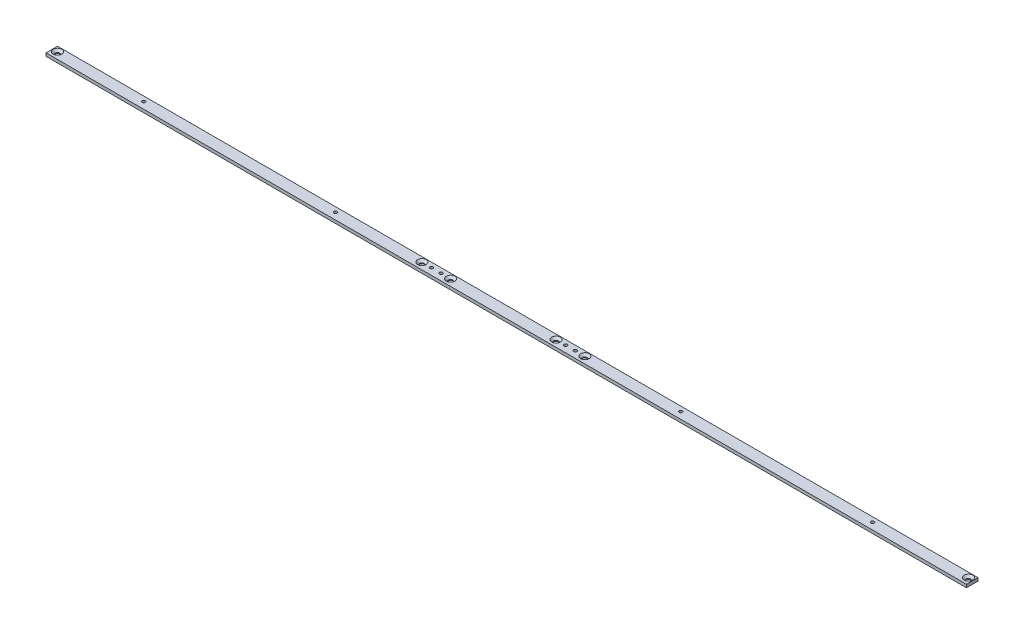
ISO-10303-21;
HEADER;
FILE_DESCRIPTION(('STEP AP214'),'2;1');
FILE_NAME('part.step','',(''),(''),'','','');
FILE_SCHEMA(('AUTOMOTIVE_DESIGN { 1 0 10303 214 1 1 1 1 }'));
ENDSEC;
DATA;
#1=APPLICATION_CONTEXT('core data for automotive mechanical design processes');
#2=APPLICATION_PROTOCOL_DEFINITION('international standard','automotive_design',2000,#1);
#3=PRODUCT_CONTEXT('',#1,'mechanical');
#4=PRODUCT('Part','Part','',(#3));
#5=PRODUCT_RELATED_PRODUCT_CATEGORY('part','',(#4));
#6=PRODUCT_DEFINITION_FORMATION('','',#4);
#7=PRODUCT_DEFINITION_CONTEXT('part definition',#1,'design');
#8=PRODUCT_DEFINITION('design','',#6,#7);
#9=PRODUCT_DEFINITION_SHAPE('','',#8);
#10=(LENGTH_UNIT() NAMED_UNIT(*) SI_UNIT(.MILLI.,.METRE.));
#11=(NAMED_UNIT(*) PLANE_ANGLE_UNIT() SI_UNIT($,.RADIAN.));
#12=(NAMED_UNIT(*) SI_UNIT($,.STERADIAN.) SOLID_ANGLE_UNIT());
#13=UNCERTAINTY_MEASURE_WITH_UNIT(LENGTH_MEASURE(1.E-05),#10,'distance_accuracy_value','');
#14=(GEOMETRIC_REPRESENTATION_CONTEXT(3) GLOBAL_UNCERTAINTY_ASSIGNED_CONTEXT((#13)) GLOBAL_UNIT_ASSIGNED_CONTEXT((#10,
#11,#12)) REPRESENTATION_CONTEXT('',''));
#15=CARTESIAN_POINT('',(0.,0.,0.));
#16=DIRECTION('',(0.,0.,1.));
#17=DIRECTION('',(1.,0.,0.));
#18=AXIS2_PLACEMENT_3D('',#15,#16,#17);
#19=CARTESIAN_POINT('',(0.,0.,0.));
#20=DIRECTION('',(0.,-1.,0.));
#21=DIRECTION('',(0.,0.,-1.));
#22=AXIS2_PLACEMENT_3D('',#19,#20,#21);
#23=PLANE('',#22);
#24=CARTESIAN_POINT('',(-85.0000000000001,0.,-1.));
#25=DIRECTION('',(0.,1.,0.));
#26=DIRECTION('',(0.,0.,1.));
#27=AXIS2_PLACEMENT_3D('',#24,#25,#26);
#28=CIRCLE('',#27,1.65);
#29=CARTESIAN_POINT('',(-85.0000000000001,0.,0.649999999999999));
#30=VERTEX_POINT('',#29);
#31=EDGE_CURVE('E261',#30,#30,#28,.T.);
#32=ORIENTED_EDGE('',*,*,#31,.T.);
#33=EDGE_LOOP('',(#32));
#34=FACE_BOUND('',#33,.T.);
#35=CARTESIAN_POINT('',(-185.,0.,-1.00000000000004));
#36=DIRECTION('',(0.,1.,0.));
#37=DIRECTION('',(0.,0.,1.));
#38=AXIS2_PLACEMENT_3D('',#35,#36,#37);
#39=CIRCLE('',#38,1.65000000000001);
#40=CARTESIAN_POINT('',(-185.,0.,0.649999999999973));
#41=VERTEX_POINT('',#40);
#42=EDGE_CURVE('E205',#41,#41,#39,.T.);
#43=ORIENTED_EDGE('',*,*,#42,.T.);
#44=EDGE_LOOP('',(#43));
#45=FACE_BOUND('',#44,.T.);
#46=CARTESIAN_POINT('',(475.,0.,-0.999999999999995));
#47=DIRECTION('',(0.,1.,0.));
#48=DIRECTION('',(0.,0.,1.));
#49=AXIS2_PLACEMENT_3D('',#46,#47,#48);
#50=CIRCLE('',#49,2.24999999999997);
#51=CARTESIAN_POINT('',(475.,0.,1.24999999999998));
#52=VERTEX_POINT('',#51);
#53=EDGE_CURVE('E193',#52,#52,#50,.T.);
#54=ORIENTED_EDGE('',*,*,#53,.T.);
#55=EDGE_LOOP('',(#54));
#56=FACE_BOUND('',#55,.T.);
#57=CARTESIAN_POINT('',(-95.0000000000001,0.,-0.999999999999995));
#58=DIRECTION('',(0.,1.,0.));
#59=DIRECTION('',(0.,0.,1.));
#60=AXIS2_PLACEMENT_3D('',#57,#58,#59);
#61=CIRCLE('',#60,2.25);
#62=CARTESIAN_POINT('',(-95.0000000000001,0.,1.25000000000001));
#63=VERTEX_POINT('',#62);
#64=EDGE_CURVE('E181',#63,#63,#61,.T.);
#65=ORIENTED_EDGE('',*,*,#64,.T.);
#66=EDGE_LOOP('',(#65));
#67=FACE_BOUND('',#66,.T.);
#68=CARTESIAN_POINT('',(-65.0000000000001,0.,-1.));
#69=DIRECTION('',(0.,1.,0.));
#70=DIRECTION('',(0.,0.,1.));
#71=AXIS2_PLACEMENT_3D('',#68,#69,#70);
#72=CIRCLE('',#71,2.25);
#73=CARTESIAN_POINT('',(-65.0000000000001,0.,1.25));
#74=VERTEX_POINT('',#73);
#75=EDGE_CURVE('E169',#74,#74,#72,.T.);
#76=ORIENTED_EDGE('',*,*,#75,.T.);
#77=EDGE_LOOP('',(#76));
#78=FACE_BOUND('',#77,.T.);
#79=CARTESIAN_POINT('',(44.9999999999999,0.,-1.));
#80=DIRECTION('',(0.,1.,0.));
#81=DIRECTION('',(0.,0.,1.));
#82=AXIS2_PLACEMENT_3D('',#79,#80,#81);
#83=CIRCLE('',#82,2.25);
#84=CARTESIAN_POINT('',(44.9999999999999,0.,1.25));
#85=VERTEX_POINT('',#84);
#86=EDGE_CURVE('E157',#85,#85,#83,.T.);
#87=ORIENTED_EDGE('',*,*,#86,.T.);
#88=EDGE_LOOP('',(#87));
#89=FACE_BOUND('',#88,.T.);
#90=CARTESIAN_POINT('',(74.9999999999999,0.,-1.00000000000001));
#91=DIRECTION('',(0.,1.,0.));
#92=DIRECTION('',(0.,0.,1.));
#93=AXIS2_PLACEMENT_3D('',#90,#91,#92);
#94=CIRCLE('',#93,2.25);
#95=CARTESIAN_POINT('',(74.9999999999999,0.,1.25));
#96=VERTEX_POINT('',#95);
#97=EDGE_CURVE('E145',#96,#96,#94,.T.);
#98=ORIENTED_EDGE('',*,*,#97,.T.);
#99=EDGE_LOOP('',(#98));
#100=FACE_BOUND('',#99,.T.);
#101=CARTESIAN_POINT('',(-475.,0.,-1.));
#102=DIRECTION('',(0.,1.,0.));
#103=DIRECTION('',(0.,0.,1.));
#104=AXIS2_PLACEMENT_3D('',#101,#102,#103);
#105=CIRCLE('',#104,2.24999999999997);
#106=CARTESIAN_POINT('',(-475.,0.,1.24999999999997));
#107=VERTEX_POINT('',#106);
#108=EDGE_CURVE('E117',#107,#107,#105,.T.);
#109=ORIENTED_EDGE('',*,*,#108,.T.);
#110=EDGE_LOOP('',(#109));
#111=FACE_BOUND('',#110,.T.);
#112=DIRECTION('',(0.,0.,-1.));
#113=VECTOR('',#112,1.);
#114=CARTESIAN_POINT('',(480.,0.,6.));
#115=LINE('',#114,#113);
#116=CARTESIAN_POINT('',(480.,0.,6.));
#117=VERTEX_POINT('',#116);
#118=CARTESIAN_POINT('',(480.,0.,-6.));
#119=VERTEX_POINT('',#118);
#120=EDGE_CURVE('E113',#117,#119,#115,.T.);
#121=ORIENTED_EDGE('',*,*,#120,.F.);
#122=DIRECTION('',(1.,0.,0.));
#123=VECTOR('',#122,1.);
#124=CARTESIAN_POINT('',(-480.,0.,6.));
#125=LINE('',#124,#123);
#126=CARTESIAN_POINT('',(-480.,0.,6.));
#127=VERTEX_POINT('',#126);
#128=EDGE_CURVE('E84',#127,#117,#125,.T.);
#129=ORIENTED_EDGE('',*,*,#128,.F.);
#130=DIRECTION('',(0.,0.,1.));
#131=VECTOR('',#130,1.);
#132=CARTESIAN_POINT('',(-480.,0.,6.));
#133=LINE('',#132,#131);
#134=CARTESIAN_POINT('',(-480.,0.,-6.));
#135=VERTEX_POINT('',#134);
#136=EDGE_CURVE('E78',#135,#127,#133,.T.);
#137=ORIENTED_EDGE('',*,*,#136,.F.);
#138=DIRECTION('',(-1.,0.,0.));
#139=VECTOR('',#138,1.);
#140=CARTESIAN_POINT('',(-480.,0.,-6.));
#141=LINE('',#140,#139);
#142=EDGE_CURVE('E102',#119,#135,#141,.T.);
#143=ORIENTED_EDGE('',*,*,#142,.F.);
#144=EDGE_LOOP('',(#121,#129,#137,#143));
#145=FACE_BOUND('',#144,.T.);
#146=CARTESIAN_POINT('',(-385.,0.,-1.));
#147=DIRECTION('',(0.,1.,0.));
#148=DIRECTION('',(0.,0.,1.));
#149=AXIS2_PLACEMENT_3D('',#146,#147,#148);
#150=CIRCLE('',#149,1.64999999999998);
#151=CARTESIAN_POINT('',(-385.,0.,0.649999999999984));
#152=VERTEX_POINT('',#151);
#153=EDGE_CURVE('E213',#152,#152,#150,.T.);
#154=ORIENTED_EDGE('',*,*,#153,.T.);
#155=EDGE_LOOP('',(#154));
#156=FACE_BOUND('',#155,.T.);
#157=CARTESIAN_POINT('',(375.,0.,-1.00000000000006));
#158=DIRECTION('',(0.,1.,0.));
#159=DIRECTION('',(0.,0.,1.));
#160=AXIS2_PLACEMENT_3D('',#157,#158,#159);
#161=CIRCLE('',#160,1.64999999999998);
#162=CARTESIAN_POINT('',(375.,0.,0.649999999999928));
#163=VERTEX_POINT('',#162);
#164=EDGE_CURVE('E221',#163,#163,#161,.T.);
#165=ORIENTED_EDGE('',*,*,#164,.T.);
#166=EDGE_LOOP('',(#165));
#167=FACE_BOUND('',#166,.T.);
#168=CARTESIAN_POINT('',(175.,0.,-1.00000000000002));
#169=DIRECTION('',(0.,1.,0.));
#170=DIRECTION('',(0.,0.,1.));
#171=AXIS2_PLACEMENT_3D('',#168,#169,#170);
#172=CIRCLE('',#171,1.65000000000001);
#173=CARTESIAN_POINT('',(175.,0.,0.649999999999994));
#174=VERTEX_POINT('',#173);
#175=EDGE_CURVE('E229',#174,#174,#172,.T.);
#176=ORIENTED_EDGE('',*,*,#175,.T.);
#177=EDGE_LOOP('',(#176));
#178=FACE_BOUND('',#177,.T.);
#179=CARTESIAN_POINT('',(64.9999999999999,0.,-1.));
#180=DIRECTION('',(0.,1.,0.));
#181=DIRECTION('',(0.,0.,1.));
#182=AXIS2_PLACEMENT_3D('',#179,#180,#181);
#183=CIRCLE('',#182,1.65);
#184=CARTESIAN_POINT('',(64.9999999999999,0.,0.649999999999999));
#185=VERTEX_POINT('',#184);
#186=EDGE_CURVE('E237',#185,#185,#183,.T.);
#187=ORIENTED_EDGE('',*,*,#186,.T.);
#188=EDGE_LOOP('',(#187));
#189=FACE_BOUND('',#188,.T.);
#190=CARTESIAN_POINT('',(54.9999999999999,0.,-1.));
#191=DIRECTION('',(0.,1.,0.));
#192=DIRECTION('',(0.,0.,1.));
#193=AXIS2_PLACEMENT_3D('',#190,#191,#192);
#194=CIRCLE('',#193,1.65);
#195=CARTESIAN_POINT('',(54.9999999999999,0.,0.649999999999999));
#196=VERTEX_POINT('',#195);
#197=EDGE_CURVE('E245',#196,#196,#194,.T.);
#198=ORIENTED_EDGE('',*,*,#197,.T.);
#199=EDGE_LOOP('',(#198));
#200=FACE_BOUND('',#199,.T.);
#201=CARTESIAN_POINT('',(-75.0000000000001,0.,-1.));
#202=DIRECTION('',(0.,1.,0.));
#203=DIRECTION('',(0.,0.,1.));
#204=AXIS2_PLACEMENT_3D('',#201,#202,#203);
#205=CIRCLE('',#204,1.65);
#206=CARTESIAN_POINT('',(-75.0000000000001,0.,0.649999999999999));
#207=VERTEX_POINT('',#206);
#208=EDGE_CURVE('E253',#207,#207,#205,.T.);
#209=ORIENTED_EDGE('',*,*,#208,.T.);
#210=EDGE_LOOP('',(#209));
#211=FACE_BOUND('',#210,.T.);
#212=ADVANCED_FACE('F43',(#34,#45,#56,#67,#78,#89,#100,#111,#145,#156,#167,#178,#189,#200,#211),
#23,.T.);
#213=CARTESIAN_POINT('',(0.,3.175,0.));
#214=DIRECTION('',(0.,-1.,0.));
#215=DIRECTION('',(0.,0.,-1.));
#216=AXIS2_PLACEMENT_3D('',#213,#214,#215);
#217=PLANE('',#216);
#218=CARTESIAN_POINT('',(-85.0000000000001,3.175,-1.));
#219=DIRECTION('',(0.,1.,0.));
#220=DIRECTION('',(0.,0.,1.));
#221=AXIS2_PLACEMENT_3D('',#218,#219,#220);
#222=CIRCLE('',#221,1.65);
#223=CARTESIAN_POINT('',(-85.0000000000001,3.175,0.649999999999999));
#224=VERTEX_POINT('',#223);
#225=EDGE_CURVE('E265',#224,#224,#222,.T.);
#226=ORIENTED_EDGE('',*,*,#225,.F.);
#227=EDGE_LOOP('',(#226));
#228=FACE_BOUND('',#227,.T.);
#229=CARTESIAN_POINT('',(-75.0000000000001,3.175,-1.));
#230=DIRECTION('',(0.,1.,0.));
#231=DIRECTION('',(0.,0.,1.));
#232=AXIS2_PLACEMENT_3D('',#229,#230,#231);
#233=CIRCLE('',#232,1.65);
#234=CARTESIAN_POINT('',(-75.0000000000001,3.175,0.649999999999999));
#235=VERTEX_POINT('',#234);
#236=EDGE_CURVE('E257',#235,#235,#233,.T.);
#237=ORIENTED_EDGE('',*,*,#236,.F.);
#238=EDGE_LOOP('',(#237));
#239=FACE_BOUND('',#238,.T.);
#240=CARTESIAN_POINT('',(175.,3.175,-1.00000000000002));
#241=DIRECTION('',(0.,1.,0.));
#242=DIRECTION('',(0.,0.,1.));
#243=AXIS2_PLACEMENT_3D('',#240,#241,#242);
#244=CIRCLE('',#243,1.65000000000001);
#245=CARTESIAN_POINT('',(175.,3.175,0.649999999999994));
#246=VERTEX_POINT('',#245);
#247=EDGE_CURVE('E233',#246,#246,#244,.T.);
#248=ORIENTED_EDGE('',*,*,#247,.F.);
#249=EDGE_LOOP('',(#248));
#250=FACE_BOUND('',#249,.T.);
#251=CARTESIAN_POINT('',(375.,3.175,-1.00000000000006));
#252=DIRECTION('',(0.,1.,0.));
#253=DIRECTION('',(0.,0.,1.));
#254=AXIS2_PLACEMENT_3D('',#251,#252,#253);
#255=CIRCLE('',#254,1.64999999999998);
#256=CARTESIAN_POINT('',(375.,3.175,0.649999999999928));
#257=VERTEX_POINT('',#256);
#258=EDGE_CURVE('E225',#257,#257,#255,.T.);
#259=ORIENTED_EDGE('',*,*,#258,.F.);
#260=EDGE_LOOP('',(#259));
#261=FACE_BOUND('',#260,.T.);
#262=CARTESIAN_POINT('',(475.,3.175,-0.999999999999995));
#263=DIRECTION('',(0.,1.,0.));
#264=DIRECTION('',(0.,0.,1.));
#265=AXIS2_PLACEMENT_3D('',#262,#263,#264);
#266=CIRCLE('',#265,4.47999999999998);
#267=CARTESIAN_POINT('',(475.,3.175,3.47999999999999));
#268=VERTEX_POINT('',#267);
#269=EDGE_CURVE('E201',#268,#268,#266,.T.);
#270=ORIENTED_EDGE('',*,*,#269,.F.);
#271=EDGE_LOOP('',(#270));
#272=FACE_BOUND('',#271,.T.);
#273=CARTESIAN_POINT('',(-95.0000000000001,3.175,-0.999999999999995));
#274=DIRECTION('',(0.,1.,0.));
#275=DIRECTION('',(0.,0.,1.));
#276=AXIS2_PLACEMENT_3D('',#273,#274,#275);
#277=CIRCLE('',#276,4.48);
#278=CARTESIAN_POINT('',(-95.0000000000001,3.175,3.48));
#279=VERTEX_POINT('',#278);
#280=EDGE_CURVE('E189',#279,#279,#277,.T.);
#281=ORIENTED_EDGE('',*,*,#280,.F.);
#282=EDGE_LOOP('',(#281));
#283=FACE_BOUND('',#282,.T.);
#284=CARTESIAN_POINT('',(-65.0000000000001,3.175,-1.));
#285=DIRECTION('',(0.,1.,0.));
#286=DIRECTION('',(0.,0.,1.));
#287=AXIS2_PLACEMENT_3D('',#284,#285,#286);
#288=CIRCLE('',#287,4.48);
#289=CARTESIAN_POINT('',(-65.0000000000001,3.175,3.48));
#290=VERTEX_POINT('',#289);
#291=EDGE_CURVE('E177',#290,#290,#288,.T.);
#292=ORIENTED_EDGE('',*,*,#291,.F.);
#293=EDGE_LOOP('',(#292));
#294=FACE_BOUND('',#293,.T.);
#295=CARTESIAN_POINT('',(44.9999999999999,3.175,-1.));
#296=DIRECTION('',(0.,1.,0.));
#297=DIRECTION('',(0.,0.,1.));
#298=AXIS2_PLACEMENT_3D('',#295,#296,#297);
#299=CIRCLE('',#298,4.48);
#300=CARTESIAN_POINT('',(44.9999999999999,3.175,3.48));
#301=VERTEX_POINT('',#300);
#302=EDGE_CURVE('E165',#301,#301,#299,.T.);
#303=ORIENTED_EDGE('',*,*,#302,.F.);
#304=EDGE_LOOP('',(#303));
#305=FACE_BOUND('',#304,.T.);
#306=CARTESIAN_POINT('',(74.9999999999999,3.175,-1.00000000000001));
#307=DIRECTION('',(0.,1.,0.));
#308=DIRECTION('',(0.,0.,1.));
#309=AXIS2_PLACEMENT_3D('',#306,#307,#308);
#310=CIRCLE('',#309,4.48);
#311=CARTESIAN_POINT('',(74.9999999999999,3.175,3.47999999999999));
#312=VERTEX_POINT('',#311);
#313=EDGE_CURVE('E153',#312,#312,#310,.T.);
#314=ORIENTED_EDGE('',*,*,#313,.F.);
#315=EDGE_LOOP('',(#314));
#316=FACE_BOUND('',#315,.T.);
#317=CARTESIAN_POINT('',(-475.,3.175,-1.));
#318=DIRECTION('',(0.,1.,0.));
#319=DIRECTION('',(0.,0.,1.));
#320=AXIS2_PLACEMENT_3D('',#317,#318,#319);
#321=CIRCLE('',#320,4.47999999999998);
#322=CARTESIAN_POINT('',(-475.,3.175,3.47999999999998));
#323=VERTEX_POINT('',#322);
#324=EDGE_CURVE('E141',#323,#323,#321,.T.);
#325=ORIENTED_EDGE('',*,*,#324,.F.);
#326=EDGE_LOOP('',(#325));
#327=FACE_BOUND('',#326,.T.);
#328=DIRECTION('',(0.,0.,-1.));
#329=VECTOR('',#328,1.);
#330=CARTESIAN_POINT('',(480.,3.175,6.));
#331=LINE('',#330,#329);
#332=CARTESIAN_POINT('',(480.,3.175,6.));
#333=VERTEX_POINT('',#332);
#334=CARTESIAN_POINT('',(480.,3.175,-6.));
#335=VERTEX_POINT('',#334);
#336=EDGE_CURVE('E97',#333,#335,#331,.T.);
#337=ORIENTED_EDGE('',*,*,#336,.T.);
#338=DIRECTION('',(-1.,0.,0.));
#339=VECTOR('',#338,1.);
#340=CARTESIAN_POINT('',(-480.,3.175,-6.));
#341=LINE('',#340,#339);
#342=CARTESIAN_POINT('',(-480.,3.175,-6.));
#343=VERTEX_POINT('',#342);
#344=EDGE_CURVE('E91',#335,#343,#341,.T.);
#345=ORIENTED_EDGE('',*,*,#344,.T.);
#346=DIRECTION('',(0.,0.,1.));
#347=VECTOR('',#346,1.);
#348=CARTESIAN_POINT('',(-480.,3.175,6.));
#349=LINE('',#348,#347);
#350=CARTESIAN_POINT('',(-480.,3.175,6.));
#351=VERTEX_POINT('',#350);
#352=EDGE_CURVE('E95',#343,#351,#349,.T.);
#353=ORIENTED_EDGE('',*,*,#352,.T.);
#354=DIRECTION('',(1.,0.,0.));
#355=VECTOR('',#354,1.);
#356=CARTESIAN_POINT('',(-480.,3.175,6.));
#357=LINE('',#356,#355);
#358=EDGE_CURVE('E61',#351,#333,#357,.T.);
#359=ORIENTED_EDGE('',*,*,#358,.T.);
#360=EDGE_LOOP('',(#337,#345,#353,#359));
#361=FACE_BOUND('',#360,.T.);
#362=CARTESIAN_POINT('',(-185.,3.175,-1.00000000000004));
#363=DIRECTION('',(0.,1.,0.));
#364=DIRECTION('',(0.,0.,1.));
#365=AXIS2_PLACEMENT_3D('',#362,#363,#364);
#366=CIRCLE('',#365,1.65000000000001);
#367=CARTESIAN_POINT('',(-185.,3.175,0.649999999999973));
#368=VERTEX_POINT('',#367);
#369=EDGE_CURVE('E209',#368,#368,#366,.T.);
#370=ORIENTED_EDGE('',*,*,#369,.F.);
#371=EDGE_LOOP('',(#370));
#372=FACE_BOUND('',#371,.T.);
#373=CARTESIAN_POINT('',(-385.,3.175,-1.));
#374=DIRECTION('',(0.,1.,0.));
#375=DIRECTION('',(0.,0.,1.));
#376=AXIS2_PLACEMENT_3D('',#373,#374,#375);
#377=CIRCLE('',#376,1.64999999999998);
#378=CARTESIAN_POINT('',(-385.,3.175,0.649999999999984));
#379=VERTEX_POINT('',#378);
#380=EDGE_CURVE('E217',#379,#379,#377,.T.);
#381=ORIENTED_EDGE('',*,*,#380,.F.);
#382=EDGE_LOOP('',(#381));
#383=FACE_BOUND('',#382,.T.);
#384=CARTESIAN_POINT('',(64.9999999999999,3.175,-1.));
#385=DIRECTION('',(0.,1.,0.));
#386=DIRECTION('',(0.,0.,1.));
#387=AXIS2_PLACEMENT_3D('',#384,#385,#386);
#388=CIRCLE('',#387,1.65);
#389=CARTESIAN_POINT('',(64.9999999999999,3.175,0.649999999999999));
#390=VERTEX_POINT('',#389);
#391=EDGE_CURVE('E241',#390,#390,#388,.T.);
#392=ORIENTED_EDGE('',*,*,#391,.F.);
#393=EDGE_LOOP('',(#392));
#394=FACE_BOUND('',#393,.T.);
#395=CARTESIAN_POINT('',(54.9999999999999,3.175,-1.));
#396=DIRECTION('',(0.,1.,0.));
#397=DIRECTION('',(0.,0.,1.));
#398=AXIS2_PLACEMENT_3D('',#395,#396,#397);
#399=CIRCLE('',#398,1.65);
#400=CARTESIAN_POINT('',(54.9999999999999,3.175,0.649999999999999));
#401=VERTEX_POINT('',#400);
#402=EDGE_CURVE('E249',#401,#401,#399,.T.);
#403=ORIENTED_EDGE('',*,*,#402,.F.);
#404=EDGE_LOOP('',(#403));
#405=FACE_BOUND('',#404,.T.);
#406=ADVANCED_FACE('F92',(#228,#239,#250,#261,#272,#283,#294,#305,#316,#327,#361,#372,#383,#394,
#405),#217,.F.);
#407=CARTESIAN_POINT('',(480.,3.175,6.));
#408=DIRECTION('',(-1.,0.,0.));
#409=DIRECTION('',(0.,0.,1.));
#410=AXIS2_PLACEMENT_3D('',#407,#408,#409);
#411=PLANE('',#410);
#412=ORIENTED_EDGE('',*,*,#120,.T.);
#413=DIRECTION('',(0.,-1.,0.));
#414=VECTOR('',#413,1.);
#415=CARTESIAN_POINT('',(480.,3.175,-6.));
#416=LINE('',#415,#414);
#417=EDGE_CURVE('E11',#335,#119,#416,.T.);
#418=ORIENTED_EDGE('',*,*,#417,.F.);
#419=ORIENTED_EDGE('',*,*,#336,.F.);
#420=DIRECTION('',(0.,-1.,0.));
#421=VECTOR('',#420,1.);
#422=CARTESIAN_POINT('',(480.,3.175,6.));
#423=LINE('',#422,#421);
#424=EDGE_CURVE('E109',#333,#117,#423,.T.);
#425=ORIENTED_EDGE('',*,*,#424,.T.);
#426=EDGE_LOOP('',(#412,#418,#419,#425));
#427=FACE_BOUND('',#426,.T.);
#428=ADVANCED_FACE('F45',(#427),#411,.F.);
#429=CARTESIAN_POINT('',(-480.,3.175,-6.));
#430=DIRECTION('',(0.,0.,1.));
#431=DIRECTION('',(1.,0.,0.));
#432=AXIS2_PLACEMENT_3D('',#429,#430,#431);
#433=PLANE('',#432);
#434=ORIENTED_EDGE('',*,*,#142,.T.);
#435=DIRECTION('',(0.,-1.,0.));
#436=VECTOR('',#435,1.);
#437=CARTESIAN_POINT('',(-480.,3.175,-6.));
#438=LINE('',#437,#436);
#439=EDGE_CURVE('E53',#343,#135,#438,.T.);
#440=ORIENTED_EDGE('',*,*,#439,.F.);
#441=ORIENTED_EDGE('',*,*,#344,.F.);
#442=ORIENTED_EDGE('',*,*,#417,.T.);
#443=EDGE_LOOP('',(#434,#440,#441,#442));
#444=FACE_BOUND('',#443,.T.);
#445=ADVANCED_FACE('F101',(#444),#433,.F.);
#446=CARTESIAN_POINT('',(-480.,3.175,6.));
#447=DIRECTION('',(1.,0.,0.));
#448=DIRECTION('',(0.,0.,-1.));
#449=AXIS2_PLACEMENT_3D('',#446,#447,#448);
#450=PLANE('',#449);
#451=ORIENTED_EDGE('',*,*,#136,.T.);
#452=DIRECTION('',(0.,-1.,0.));
#453=VECTOR('',#452,1.);
#454=CARTESIAN_POINT('',(-480.,3.175,6.));
#455=LINE('',#454,#453);
#456=EDGE_CURVE('E104',#351,#127,#455,.T.);
#457=ORIENTED_EDGE('',*,*,#456,.F.);
#458=ORIENTED_EDGE('',*,*,#352,.F.);
#459=ORIENTED_EDGE('',*,*,#439,.T.);
#460=EDGE_LOOP('',(#451,#457,#458,#459));
#461=FACE_BOUND('',#460,.T.);
#462=ADVANCED_FACE('F105',(#461),#450,.F.);
#463=CARTESIAN_POINT('',(-480.,3.175,6.));
#464=DIRECTION('',(0.,0.,-1.));
#465=DIRECTION('',(-1.,0.,0.));
#466=AXIS2_PLACEMENT_3D('',#463,#464,#465);
#467=PLANE('',#466);
#468=ORIENTED_EDGE('',*,*,#128,.T.);
#469=ORIENTED_EDGE('',*,*,#424,.F.);
#470=ORIENTED_EDGE('',*,*,#358,.F.);
#471=ORIENTED_EDGE('',*,*,#456,.T.);
#472=EDGE_LOOP('',(#468,#469,#470,#471));
#473=FACE_BOUND('',#472,.T.);
#474=ADVANCED_FACE('F127',(#473),#467,.F.);
#475=CARTESIAN_POINT('',(-475.,3.175,-1.));
#476=DIRECTION('',(0.,1.,0.));
#477=DIRECTION('',(0.,0.,1.));
#478=AXIS2_PLACEMENT_3D('',#475,#476,#477);
#479=CYLINDRICAL_SURFACE('',#478,2.24999999999997);
#480=ORIENTED_EDGE('',*,*,#108,.F.);
#481=EDGE_LOOP('',(#480));
#482=FACE_BOUND('',#481,.T.);
#483=CARTESIAN_POINT('',(-475.,0.945000000000001,-1.));
#484=DIRECTION('',(0.,1.,0.));
#485=DIRECTION('',(0.,0.,1.));
#486=AXIS2_PLACEMENT_3D('',#483,#484,#485);
#487=CIRCLE('',#486,2.24999999999997);
#488=CARTESIAN_POINT('',(-475.,0.945000000000001,1.24999999999997));
#489=VERTEX_POINT('',#488);
#490=EDGE_CURVE('E137',#489,#489,#487,.T.);
#491=ORIENTED_EDGE('',*,*,#490,.T.);
#492=EDGE_LOOP('',(#491));
#493=FACE_BOUND('',#492,.T.);
#494=ADVANCED_FACE('F296',(#482,#493),#479,.F.);
#495=CARTESIAN_POINT('',(-475.,3.175,-1.));
#496=DIRECTION('',(0.,1.,0.));
#497=DIRECTION('',(0.,0.,1.));
#498=AXIS2_PLACEMENT_3D('',#495,#496,#497);
#499=CONICAL_SURFACE('',#498,4.47999999999998,0.785398163397451);
#500=ORIENTED_EDGE('',*,*,#490,.F.);
#501=EDGE_LOOP('',(#500));
#502=FACE_BOUND('',#501,.T.);
#503=ORIENTED_EDGE('',*,*,#324,.T.);
#504=EDGE_LOOP('',(#503));
#505=FACE_BOUND('',#504,.T.);
#506=ADVANCED_FACE('F293',(#502,#505),#499,.F.);
#507=CARTESIAN_POINT('',(74.9999999999999,3.175,-1.00000000000001));
#508=DIRECTION('',(0.,1.,0.));
#509=DIRECTION('',(0.,0.,1.));
#510=AXIS2_PLACEMENT_3D('',#507,#508,#509);
#511=CYLINDRICAL_SURFACE('',#510,2.25);
#512=ORIENTED_EDGE('',*,*,#97,.F.);
#513=EDGE_LOOP('',(#512));
#514=FACE_BOUND('',#513,.T.);
#515=CARTESIAN_POINT('',(74.9999999999999,0.945000000000001,-1.00000000000001));
#516=DIRECTION('',(0.,1.,0.));
#517=DIRECTION('',(0.,0.,1.));
#518=AXIS2_PLACEMENT_3D('',#515,#516,#517);
#519=CIRCLE('',#518,2.25);
#520=CARTESIAN_POINT('',(74.9999999999999,0.945000000000001,1.25));
#521=VERTEX_POINT('',#520);
#522=EDGE_CURVE('E149',#521,#521,#519,.T.);
#523=ORIENTED_EDGE('',*,*,#522,.T.);
#524=EDGE_LOOP('',(#523));
#525=FACE_BOUND('',#524,.T.);
#526=ADVANCED_FACE('F295',(#514,#525),#511,.F.);
#527=CARTESIAN_POINT('',(74.9999999999999,3.175,-1.00000000000001));
#528=DIRECTION('',(0.,1.,0.));
#529=DIRECTION('',(0.,0.,1.));
#530=AXIS2_PLACEMENT_3D('',#527,#528,#529);
#531=CONICAL_SURFACE('',#530,4.48,0.785398163397448);
#532=ORIENTED_EDGE('',*,*,#522,.F.);
#533=EDGE_LOOP('',(#532));
#534=FACE_BOUND('',#533,.T.);
#535=ORIENTED_EDGE('',*,*,#313,.T.);
#536=EDGE_LOOP('',(#535));
#537=FACE_BOUND('',#536,.T.);
#538=ADVANCED_FACE('F303',(#534,#537),#531,.F.);
#539=CARTESIAN_POINT('',(44.9999999999999,3.175,-1.));
#540=DIRECTION('',(0.,1.,0.));
#541=DIRECTION('',(0.,0.,1.));
#542=AXIS2_PLACEMENT_3D('',#539,#540,#541);
#543=CYLINDRICAL_SURFACE('',#542,2.25);
#544=ORIENTED_EDGE('',*,*,#86,.F.);
#545=EDGE_LOOP('',(#544));
#546=FACE_BOUND('',#545,.T.);
#547=CARTESIAN_POINT('',(44.9999999999999,0.945000000000001,-1.));
#548=DIRECTION('',(0.,1.,0.));
#549=DIRECTION('',(0.,0.,1.));
#550=AXIS2_PLACEMENT_3D('',#547,#548,#549);
#551=CIRCLE('',#550,2.25);
#552=CARTESIAN_POINT('',(44.9999999999999,0.945000000000001,1.25));
#553=VERTEX_POINT('',#552);
#554=EDGE_CURVE('E161',#553,#553,#551,.T.);
#555=ORIENTED_EDGE('',*,*,#554,.T.);
#556=EDGE_LOOP('',(#555));
#557=FACE_BOUND('',#556,.T.);
#558=ADVANCED_FACE('F531',(#546,#557),#543,.F.);
#559=CARTESIAN_POINT('',(44.9999999999999,3.175,-1.));
#560=DIRECTION('',(0.,1.,0.));
#561=DIRECTION('',(0.,0.,1.));
#562=AXIS2_PLACEMENT_3D('',#559,#560,#561);
#563=CONICAL_SURFACE('',#562,4.48,0.785398163397448);
#564=ORIENTED_EDGE('',*,*,#554,.F.);
#565=EDGE_LOOP('',(#564));
#566=FACE_BOUND('',#565,.T.);
#567=ORIENTED_EDGE('',*,*,#302,.T.);
#568=EDGE_LOOP('',(#567));
#569=FACE_BOUND('',#568,.T.);
#570=ADVANCED_FACE('F521',(#566,#569),#563,.F.);
#571=CARTESIAN_POINT('',(-65.0000000000001,3.175,-1.));
#572=DIRECTION('',(0.,1.,0.));
#573=DIRECTION('',(0.,0.,1.));
#574=AXIS2_PLACEMENT_3D('',#571,#572,#573);
#575=CYLINDRICAL_SURFACE('',#574,2.25);
#576=ORIENTED_EDGE('',*,*,#75,.F.);
#577=EDGE_LOOP('',(#576));
#578=FACE_BOUND('',#577,.T.);
#579=CARTESIAN_POINT('',(-65.0000000000001,0.945000000000001,-1.));
#580=DIRECTION('',(0.,1.,0.));
#581=DIRECTION('',(0.,0.,1.));
#582=AXIS2_PLACEMENT_3D('',#579,#580,#581);
#583=CIRCLE('',#582,2.25);
#584=CARTESIAN_POINT('',(-65.0000000000001,0.945000000000001,1.25));
#585=VERTEX_POINT('',#584);
#586=EDGE_CURVE('E173',#585,#585,#583,.T.);
#587=ORIENTED_EDGE('',*,*,#586,.T.);
#588=EDGE_LOOP('',(#587));
#589=FACE_BOUND('',#588,.T.);
#590=ADVANCED_FACE('F511',(#578,#589),#575,.F.);
#591=CARTESIAN_POINT('',(-65.0000000000001,3.175,-1.));
#592=DIRECTION('',(0.,1.,0.));
#593=DIRECTION('',(0.,0.,1.));
#594=AXIS2_PLACEMENT_3D('',#591,#592,#593);
#595=CONICAL_SURFACE('',#594,4.48,0.785398163397448);
#596=ORIENTED_EDGE('',*,*,#586,.F.);
#597=EDGE_LOOP('',(#596));
#598=FACE_BOUND('',#597,.T.);
#599=ORIENTED_EDGE('',*,*,#291,.T.);
#600=EDGE_LOOP('',(#599));
#601=FACE_BOUND('',#600,.T.);
#602=ADVANCED_FACE('F501',(#598,#601),#595,.F.);
#603=CARTESIAN_POINT('',(-95.0000000000001,3.175,-0.999999999999995));
#604=DIRECTION('',(0.,1.,0.));
#605=DIRECTION('',(0.,0.,1.));
#606=AXIS2_PLACEMENT_3D('',#603,#604,#605);
#607=CYLINDRICAL_SURFACE('',#606,2.25);
#608=ORIENTED_EDGE('',*,*,#64,.F.);
#609=EDGE_LOOP('',(#608));
#610=FACE_BOUND('',#609,.T.);
#611=CARTESIAN_POINT('',(-95.0000000000001,0.945000000000001,-0.999999999999995));
#612=DIRECTION('',(0.,1.,0.));
#613=DIRECTION('',(0.,0.,1.));
#614=AXIS2_PLACEMENT_3D('',#611,#612,#613);
#615=CIRCLE('',#614,2.25);
#616=CARTESIAN_POINT('',(-95.0000000000001,0.945000000000001,1.25000000000001));
#617=VERTEX_POINT('',#616);
#618=EDGE_CURVE('E185',#617,#617,#615,.T.);
#619=ORIENTED_EDGE('',*,*,#618,.T.);
#620=EDGE_LOOP('',(#619));
#621=FACE_BOUND('',#620,.T.);
#622=ADVANCED_FACE('F491',(#610,#621),#607,.F.);
#623=CARTESIAN_POINT('',(-95.0000000000001,3.175,-0.999999999999995));
#624=DIRECTION('',(0.,1.,0.));
#625=DIRECTION('',(0.,0.,1.));
#626=AXIS2_PLACEMENT_3D('',#623,#624,#625);
#627=CONICAL_SURFACE('',#626,4.48,0.785398163397448);
#628=ORIENTED_EDGE('',*,*,#618,.F.);
#629=EDGE_LOOP('',(#628));
#630=FACE_BOUND('',#629,.T.);
#631=ORIENTED_EDGE('',*,*,#280,.T.);
#632=EDGE_LOOP('',(#631));
#633=FACE_BOUND('',#632,.T.);
#634=ADVANCED_FACE('F481',(#630,#633),#627,.F.);
#635=CARTESIAN_POINT('',(475.,3.175,-0.999999999999995));
#636=DIRECTION('',(0.,1.,0.));
#637=DIRECTION('',(0.,0.,1.));
#638=AXIS2_PLACEMENT_3D('',#635,#636,#637);
#639=CYLINDRICAL_SURFACE('',#638,2.24999999999997);
#640=ORIENTED_EDGE('',*,*,#53,.F.);
#641=EDGE_LOOP('',(#640));
#642=FACE_BOUND('',#641,.T.);
#643=CARTESIAN_POINT('',(475.,0.945000000000001,-0.999999999999995));
#644=DIRECTION('',(0.,1.,0.));
#645=DIRECTION('',(0.,0.,1.));
#646=AXIS2_PLACEMENT_3D('',#643,#644,#645);
#647=CIRCLE('',#646,2.24999999999997);
#648=CARTESIAN_POINT('',(475.,0.945000000000001,1.24999999999998));
#649=VERTEX_POINT('',#648);
#650=EDGE_CURVE('E197',#649,#649,#647,.T.);
#651=ORIENTED_EDGE('',*,*,#650,.T.);
#652=EDGE_LOOP('',(#651));
#653=FACE_BOUND('',#652,.T.);
#654=ADVANCED_FACE('F472',(#642,#653),#639,.F.);
#655=CARTESIAN_POINT('',(475.,3.175,-0.999999999999995));
#656=DIRECTION('',(0.,1.,0.));
#657=DIRECTION('',(0.,0.,1.));
#658=AXIS2_PLACEMENT_3D('',#655,#656,#657);
#659=CONICAL_SURFACE('',#658,4.47999999999998,0.785398163397451);
#660=ORIENTED_EDGE('',*,*,#650,.F.);
#661=EDGE_LOOP('',(#660));
#662=FACE_BOUND('',#661,.T.);
#663=ORIENTED_EDGE('',*,*,#269,.T.);
#664=EDGE_LOOP('',(#663));
#665=FACE_BOUND('',#664,.T.);
#666=ADVANCED_FACE('F397',(#662,#665),#659,.F.);
#667=CARTESIAN_POINT('',(-185.,3.175,-1.00000000000004));
#668=DIRECTION('',(0.,1.,0.));
#669=DIRECTION('',(0.,0.,1.));
#670=AXIS2_PLACEMENT_3D('',#667,#668,#669);
#671=CYLINDRICAL_SURFACE('',#670,1.65000000000001);
#672=ORIENTED_EDGE('',*,*,#42,.F.);
#673=EDGE_LOOP('',(#672));
#674=FACE_BOUND('',#673,.T.);
#675=ORIENTED_EDGE('',*,*,#369,.T.);
#676=EDGE_LOOP('',(#675));
#677=FACE_BOUND('',#676,.T.);
#678=ADVANCED_FACE('F392',(#674,#677),#671,.F.);
#679=CARTESIAN_POINT('',(-385.,3.175,-1.));
#680=DIRECTION('',(0.,1.,0.));
#681=DIRECTION('',(0.,0.,1.));
#682=AXIS2_PLACEMENT_3D('',#679,#680,#681);
#683=CYLINDRICAL_SURFACE('',#682,1.64999999999998);
#684=ORIENTED_EDGE('',*,*,#153,.F.);
#685=EDGE_LOOP('',(#684));
#686=FACE_BOUND('',#685,.T.);
#687=ORIENTED_EDGE('',*,*,#380,.T.);
#688=EDGE_LOOP('',(#687));
#689=FACE_BOUND('',#688,.T.);
#690=ADVANCED_FACE('F396',(#686,#689),#683,.F.);
#691=CARTESIAN_POINT('',(375.,3.175,-1.00000000000006));
#692=DIRECTION('',(0.,1.,0.));
#693=DIRECTION('',(0.,0.,1.));
#694=AXIS2_PLACEMENT_3D('',#691,#692,#693);
#695=CYLINDRICAL_SURFACE('',#694,1.64999999999998);
#696=ORIENTED_EDGE('',*,*,#164,.F.);
#697=EDGE_LOOP('',(#696));
#698=FACE_BOUND('',#697,.T.);
#699=ORIENTED_EDGE('',*,*,#258,.T.);
#700=EDGE_LOOP('',(#699));
#701=FACE_BOUND('',#700,.T.);
#702=ADVANCED_FACE('F340',(#698,#701),#695,.F.);
#703=CARTESIAN_POINT('',(175.,3.175,-1.00000000000002));
#704=DIRECTION('',(0.,1.,0.));
#705=DIRECTION('',(0.,0.,1.));
#706=AXIS2_PLACEMENT_3D('',#703,#704,#705);
#707=CYLINDRICAL_SURFACE('',#706,1.65000000000001);
#708=ORIENTED_EDGE('',*,*,#175,.F.);
#709=EDGE_LOOP('',(#708));
#710=FACE_BOUND('',#709,.T.);
#711=ORIENTED_EDGE('',*,*,#247,.T.);
#712=EDGE_LOOP('',(#711));
#713=FACE_BOUND('',#712,.T.);
#714=ADVANCED_FACE('F335',(#710,#713),#707,.F.);
#715=CARTESIAN_POINT('',(64.9999999999999,3.175,-1.));
#716=DIRECTION('',(0.,1.,0.));
#717=DIRECTION('',(0.,0.,1.));
#718=AXIS2_PLACEMENT_3D('',#715,#716,#717);
#719=CYLINDRICAL_SURFACE('',#718,1.65);
#720=ORIENTED_EDGE('',*,*,#186,.F.);
#721=EDGE_LOOP('',(#720));
#722=FACE_BOUND('',#721,.T.);
#723=ORIENTED_EDGE('',*,*,#391,.T.);
#724=EDGE_LOOP('',(#723));
#725=FACE_BOUND('',#724,.T.);
#726=ADVANCED_FACE('F339',(#722,#725),#719,.F.);
#727=CARTESIAN_POINT('',(54.9999999999999,3.175,-1.));
#728=DIRECTION('',(0.,1.,0.));
#729=DIRECTION('',(0.,0.,1.));
#730=AXIS2_PLACEMENT_3D('',#727,#728,#729);
#731=CYLINDRICAL_SURFACE('',#730,1.65);
#732=ORIENTED_EDGE('',*,*,#197,.F.);
#733=EDGE_LOOP('',(#732));
#734=FACE_BOUND('',#733,.T.);
#735=ORIENTED_EDGE('',*,*,#402,.T.);
#736=EDGE_LOOP('',(#735));
#737=FACE_BOUND('',#736,.T.);
#738=ADVANCED_FACE('F355',(#734,#737),#731,.F.);
#739=CARTESIAN_POINT('',(-75.0000000000001,3.175,-1.));
#740=DIRECTION('',(0.,1.,0.));
#741=DIRECTION('',(0.,0.,1.));
#742=AXIS2_PLACEMENT_3D('',#739,#740,#741);
#743=CYLINDRICAL_SURFACE('',#742,1.65);
#744=ORIENTED_EDGE('',*,*,#208,.F.);
#745=EDGE_LOOP('',(#744));
#746=FACE_BOUND('',#745,.T.);
#747=ORIENTED_EDGE('',*,*,#236,.T.);
#748=EDGE_LOOP('',(#747));
#749=FACE_BOUND('',#748,.T.);
#750=ADVANCED_FACE('F363',(#746,#749),#743,.F.);
#751=CARTESIAN_POINT('',(-85.0000000000001,3.175,-1.));
#752=DIRECTION('',(0.,1.,0.));
#753=DIRECTION('',(0.,0.,1.));
#754=AXIS2_PLACEMENT_3D('',#751,#752,#753);
#755=CYLINDRICAL_SURFACE('',#754,1.65);
#756=ORIENTED_EDGE('',*,*,#31,.F.);
#757=EDGE_LOOP('',(#756));
#758=FACE_BOUND('',#757,.T.);
#759=ORIENTED_EDGE('',*,*,#225,.T.);
#760=EDGE_LOOP('',(#759));
#761=FACE_BOUND('',#760,.T.);
#762=ADVANCED_FACE('F270',(#758,#761),#755,.F.);
#763=CLOSED_SHELL('',(#212,#406,#428,#445,#462,#474,#494,#506,#526,#538,#558,#570,#590,#602,
#622,#634,#654,#666,#678,#690,#702,#714,#726,#738,#750,#762));
#764=MANIFOLD_SOLID_BREP('B2',#763);
#765=ADVANCED_BREP_SHAPE_REPRESENTATION('',(#18,#764),#14);
#766=SHAPE_DEFINITION_REPRESENTATION(#9,#765);
ENDSEC;
END-ISO-10303-21;
